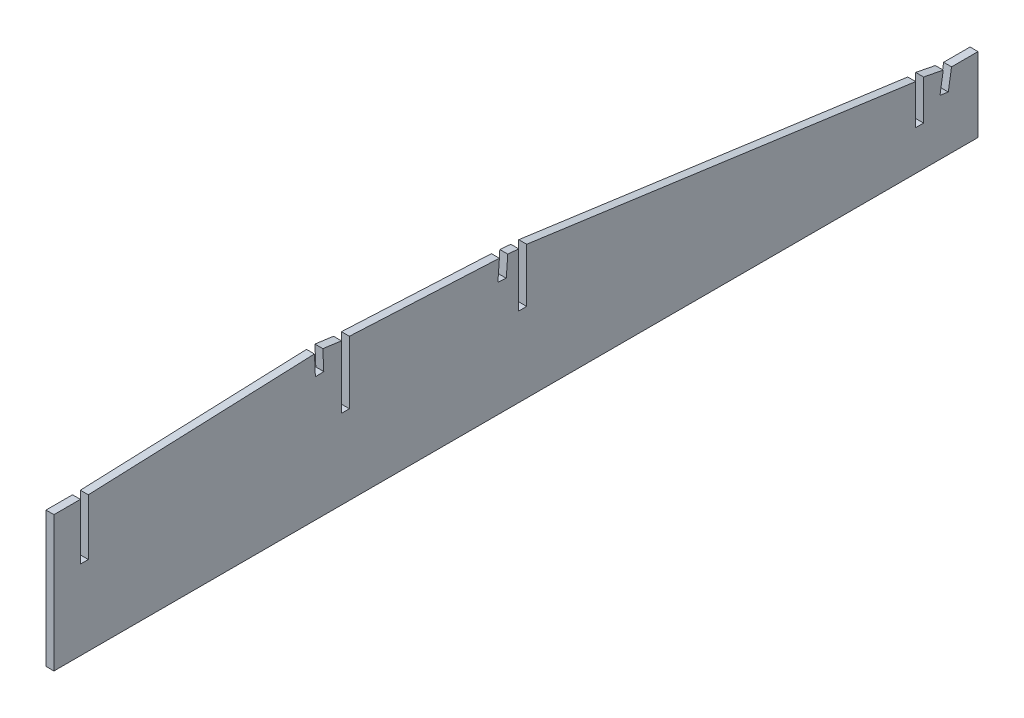
ISO-10303-21;
HEADER;
FILE_DESCRIPTION(('STEP AP214'),'2;1');
FILE_NAME('part.step','',(''),(''),'','','');
FILE_SCHEMA(('AUTOMOTIVE_DESIGN { 1 0 10303 214 1 1 1 1 }'));
ENDSEC;
DATA;
#1=APPLICATION_CONTEXT('core data for automotive mechanical design processes');
#2=APPLICATION_PROTOCOL_DEFINITION('international standard','automotive_design',2000,#1);
#3=PRODUCT_CONTEXT('',#1,'mechanical');
#4=PRODUCT('Part','Part','',(#3));
#5=PRODUCT_RELATED_PRODUCT_CATEGORY('part','',(#4));
#6=PRODUCT_DEFINITION_FORMATION('','',#4);
#7=PRODUCT_DEFINITION_CONTEXT('part definition',#1,'design');
#8=PRODUCT_DEFINITION('design','',#6,#7);
#9=PRODUCT_DEFINITION_SHAPE('','',#8);
#10=(LENGTH_UNIT() NAMED_UNIT(*) SI_UNIT(.MILLI.,.METRE.));
#11=(NAMED_UNIT(*) PLANE_ANGLE_UNIT() SI_UNIT($,.RADIAN.));
#12=(NAMED_UNIT(*) SI_UNIT($,.STERADIAN.) SOLID_ANGLE_UNIT());
#13=UNCERTAINTY_MEASURE_WITH_UNIT(LENGTH_MEASURE(1.E-05),#10,'distance_accuracy_value','');
#14=(GEOMETRIC_REPRESENTATION_CONTEXT(3) GLOBAL_UNCERTAINTY_ASSIGNED_CONTEXT((#13)) GLOBAL_UNIT_ASSIGNED_CONTEXT((#10,
#11,#12)) REPRESENTATION_CONTEXT('',''));
#15=CARTESIAN_POINT('',(0.,0.,0.));
#16=DIRECTION('',(0.,0.,1.));
#17=DIRECTION('',(1.,0.,0.));
#18=AXIS2_PLACEMENT_3D('',#15,#16,#17);
#19=CARTESIAN_POINT('',(344.221000000001,70.9886346144314,-342.788996051984));
#20=DIRECTION('',(0.,-0.99922516636213,-0.0393581873131127));
#21=DIRECTION('',(0.,0.0393581873131127,-0.99922516636213));
#22=AXIS2_PLACEMENT_3D('',#19,#20,#21);
#23=PLANE('',#22);
#24=DIRECTION('',(0.,-0.0393581873131127,0.99922516636213));
#25=VECTOR('',#24,1.);
#26=CARTESIAN_POINT('',(341.221000000001,70.9886346144314,-342.788996051984));
#27=LINE('',#26,#25);
#28=CARTESIAN_POINT('',(341.221000000001,70.9886346144314,-342.788996051984));
#29=VERTEX_POINT('',#28);
#30=CARTESIAN_POINT('',(341.221000000001,67.6230259796438,-257.342966201798));
#31=VERTEX_POINT('',#30);
#32=EDGE_CURVE('E273',#29,#31,#27,.T.);
#33=ORIENTED_EDGE('',*,*,#32,.T.);
#34=DIRECTION('',(-1.,0.,0.));
#35=VECTOR('',#34,1.);
#36=CARTESIAN_POINT('',(344.221000000001,67.6230259796438,-257.342966201798));
#37=LINE('',#36,#35);
#38=CARTESIAN_POINT('',(344.221000000001,67.6230259796438,-257.342966201798));
#39=VERTEX_POINT('',#38);
#40=EDGE_CURVE('E11',#39,#31,#37,.T.);
#41=ORIENTED_EDGE('',*,*,#40,.F.);
#42=DIRECTION('',(0.,-0.0393581873131127,0.99922516636213));
#43=VECTOR('',#42,1.);
#44=CARTESIAN_POINT('',(344.221000000001,70.9886346144314,-342.788996051984));
#45=LINE('',#44,#43);
#46=CARTESIAN_POINT('',(344.221000000001,70.9886346144314,-342.788996051984));
#47=VERTEX_POINT('',#46);
#48=EDGE_CURVE('E335',#47,#39,#45,.T.);
#49=ORIENTED_EDGE('',*,*,#48,.F.);
#50=DIRECTION('',(-1.,0.,0.));
#51=VECTOR('',#50,1.);
#52=CARTESIAN_POINT('',(344.221000000001,70.9886346144314,-342.788996051984));
#53=LINE('',#52,#51);
#54=EDGE_CURVE('E269',#47,#29,#53,.T.);
#55=ORIENTED_EDGE('',*,*,#54,.T.);
#56=EDGE_LOOP('',(#33,#41,#49,#55));
#57=FACE_BOUND('',#56,.T.);
#58=ADVANCED_FACE('F33',(#57),#23,.F.);
#59=CARTESIAN_POINT('',(344.221000000001,67.6230259796438,-257.342966201798));
#60=DIRECTION('',(0.,0.,-1.));
#61=DIRECTION('',(-1.,0.,0.));
#62=AXIS2_PLACEMENT_3D('',#59,#60,#61);
#63=PLANE('',#62);
#64=DIRECTION('',(0.,-1.,0.));
#65=VECTOR('',#64,1.);
#66=CARTESIAN_POINT('',(341.221000000001,67.6230259796438,-257.342966201798));
#67=LINE('',#66,#65);
#68=CARTESIAN_POINT('',(341.221000000001,46.4388254453726,-257.342966201798));
#69=VERTEX_POINT('',#68);
#70=EDGE_CURVE('E276',#31,#69,#67,.T.);
#71=ORIENTED_EDGE('',*,*,#70,.T.);
#72=DIRECTION('',(-1.,0.,0.));
#73=VECTOR('',#72,1.);
#74=CARTESIAN_POINT('',(344.221000000001,46.4388254453726,-257.342966201798));
#75=LINE('',#74,#73);
#76=CARTESIAN_POINT('',(344.221000000001,46.4388254453726,-257.342966201798));
#77=VERTEX_POINT('',#76);
#78=EDGE_CURVE('E41',#77,#69,#75,.T.);
#79=ORIENTED_EDGE('',*,*,#78,.F.);
#80=DIRECTION('',(0.,-1.,0.));
#81=VECTOR('',#80,1.);
#82=CARTESIAN_POINT('',(344.221000000001,67.6230259796438,-257.342966201798));
#83=LINE('',#82,#81);
#84=EDGE_CURVE('E164',#39,#77,#83,.T.);
#85=ORIENTED_EDGE('',*,*,#84,.F.);
#86=ORIENTED_EDGE('',*,*,#40,.T.);
#87=EDGE_LOOP('',(#71,#79,#85,#86));
#88=FACE_BOUND('',#87,.T.);
#89=ADVANCED_FACE('F513',(#88),#63,.F.);
#90=CARTESIAN_POINT('',(344.221000000001,46.4388254453726,-254.342966201798));
#91=DIRECTION('',(0.,-1.,0.));
#92=DIRECTION('',(0.,0.,-1.));
#93=AXIS2_PLACEMENT_3D('',#90,#91,#92);
#94=PLANE('',#93);
#95=DIRECTION('',(0.,0.,1.));
#96=VECTOR('',#95,1.);
#97=CARTESIAN_POINT('',(341.221000000001,46.4388254453726,-254.342966201798));
#98=LINE('',#97,#96);
#99=CARTESIAN_POINT('',(341.221000000001,46.4388254453726,-254.342966201798));
#100=VERTEX_POINT('',#99);
#101=EDGE_CURVE('E278',#69,#100,#98,.T.);
#102=ORIENTED_EDGE('',*,*,#101,.T.);
#103=DIRECTION('',(-1.,0.,0.));
#104=VECTOR('',#103,1.);
#105=CARTESIAN_POINT('',(344.221000000001,46.4388254453726,-254.342966201798));
#106=LINE('',#105,#104);
#107=CARTESIAN_POINT('',(344.221000000001,46.4388254453726,-254.342966201798));
#108=VERTEX_POINT('',#107);
#109=EDGE_CURVE('E414',#108,#100,#106,.T.);
#110=ORIENTED_EDGE('',*,*,#109,.F.);
#111=DIRECTION('',(0.,0.,1.));
#112=VECTOR('',#111,1.);
#113=CARTESIAN_POINT('',(344.221000000001,46.4388254453726,-254.342966201798));
#114=LINE('',#113,#112);
#115=EDGE_CURVE('E422',#77,#108,#114,.T.);
#116=ORIENTED_EDGE('',*,*,#115,.F.);
#117=ORIENTED_EDGE('',*,*,#78,.T.);
#118=EDGE_LOOP('',(#102,#110,#116,#117));
#119=FACE_BOUND('',#118,.T.);
#120=ADVANCED_FACE('F420',(#119),#94,.F.);
#121=CARTESIAN_POINT('',(344.221000000001,67.6230259796438,-254.342966201798));
#122=DIRECTION('',(0.,0.,1.));
#123=DIRECTION('',(1.,0.,0.));
#124=AXIS2_PLACEMENT_3D('',#121,#122,#123);
#125=PLANE('',#124);
#126=DIRECTION('',(0.,1.,0.));
#127=VECTOR('',#126,1.);
#128=CARTESIAN_POINT('',(341.221000000001,67.6230259796438,-254.342966201798));
#129=LINE('',#128,#127);
#130=CARTESIAN_POINT('',(341.221000000001,67.6230259796438,-254.342966201798));
#131=VERTEX_POINT('',#130);
#132=EDGE_CURVE('E280',#100,#131,#129,.T.);
#133=ORIENTED_EDGE('',*,*,#132,.T.);
#134=DIRECTION('',(-1.,0.,0.));
#135=VECTOR('',#134,1.);
#136=CARTESIAN_POINT('',(344.221000000001,67.6230259796438,-254.342966201798));
#137=LINE('',#136,#135);
#138=CARTESIAN_POINT('',(344.221000000001,67.6230259796438,-254.342966201798));
#139=VERTEX_POINT('',#138);
#140=EDGE_CURVE('E411',#139,#131,#137,.T.);
#141=ORIENTED_EDGE('',*,*,#140,.F.);
#142=DIRECTION('',(0.,1.,0.));
#143=VECTOR('',#142,1.);
#144=CARTESIAN_POINT('',(344.221000000001,67.6230259796438,-254.342966201798));
#145=LINE('',#144,#143);
#146=EDGE_CURVE('E440',#108,#139,#145,.T.);
#147=ORIENTED_EDGE('',*,*,#146,.F.);
#148=ORIENTED_EDGE('',*,*,#109,.T.);
#149=EDGE_LOOP('',(#133,#141,#147,#148));
#150=FACE_BOUND('',#149,.T.);
#151=ADVANCED_FACE('F431',(#150),#125,.F.);
#152=CARTESIAN_POINT('',(344.221000000001,67.6230259796438,-254.342966201798));
#153=DIRECTION('',(0.,-1.,0.));
#154=DIRECTION('',(0.,0.,-1.));
#155=AXIS2_PLACEMENT_3D('',#152,#153,#154);
#156=PLANE('',#155);
#157=DIRECTION('',(0.,0.,1.));
#158=VECTOR('',#157,1.);
#159=CARTESIAN_POINT('',(341.221000000001,67.6230259796438,-254.342966201798));
#160=LINE('',#159,#158);
#161=CARTESIAN_POINT('',(341.221000000001,67.6230259796438,-244.342966201798));
#162=VERTEX_POINT('',#161);
#163=EDGE_CURVE('E282',#131,#162,#160,.T.);
#164=ORIENTED_EDGE('',*,*,#163,.T.);
#165=DIRECTION('',(-1.,0.,0.));
#166=VECTOR('',#165,1.);
#167=CARTESIAN_POINT('',(344.221000000001,67.6230259796438,-244.342966201798));
#168=LINE('',#167,#166);
#169=CARTESIAN_POINT('',(344.221000000001,67.6230259796438,-244.342966201798));
#170=VERTEX_POINT('',#169);
#171=EDGE_CURVE('E408',#170,#162,#168,.T.);
#172=ORIENTED_EDGE('',*,*,#171,.F.);
#173=DIRECTION('',(0.,0.,1.));
#174=VECTOR('',#173,1.);
#175=CARTESIAN_POINT('',(344.221000000001,67.6230259796438,-254.342966201798));
#176=LINE('',#175,#174);
#177=EDGE_CURVE('E437',#139,#170,#176,.T.);
#178=ORIENTED_EDGE('',*,*,#177,.F.);
#179=ORIENTED_EDGE('',*,*,#140,.T.);
#180=EDGE_LOOP('',(#164,#172,#178,#179));
#181=FACE_BOUND('',#180,.T.);
#182=ADVANCED_FACE('F435',(#181),#156,.F.);
#183=CARTESIAN_POINT('',(344.221000000001,67.6230259796438,-244.342966201798));
#184=DIRECTION('',(0.,0.,-1.));
#185=DIRECTION('',(-1.,0.,0.));
#186=AXIS2_PLACEMENT_3D('',#183,#184,#185);
#187=PLANE('',#186);
#188=DIRECTION('',(0.,-1.,0.));
#189=VECTOR('',#188,1.);
#190=CARTESIAN_POINT('',(341.221000000001,67.6230259796438,-244.342966201798));
#191=LINE('',#190,#189);
#192=CARTESIAN_POINT('',(341.221000000001,16.4388254453726,-244.342966201798));
#193=VERTEX_POINT('',#192);
#194=EDGE_CURVE('E284',#162,#193,#191,.T.);
#195=ORIENTED_EDGE('',*,*,#194,.T.);
#196=DIRECTION('',(-1.,0.,0.));
#197=VECTOR('',#196,1.);
#198=CARTESIAN_POINT('',(344.221000000001,16.4388254453726,-244.342966201798));
#199=LINE('',#198,#197);
#200=CARTESIAN_POINT('',(344.221000000001,16.4388254453726,-244.342966201798));
#201=VERTEX_POINT('',#200);
#202=EDGE_CURVE('E405',#201,#193,#199,.T.);
#203=ORIENTED_EDGE('',*,*,#202,.F.);
#204=DIRECTION('',(0.,-1.,0.));
#205=VECTOR('',#204,1.);
#206=CARTESIAN_POINT('',(344.221000000001,67.6230259796438,-244.342966201798));
#207=LINE('',#206,#205);
#208=EDGE_CURVE('E439',#170,#201,#207,.T.);
#209=ORIENTED_EDGE('',*,*,#208,.F.);
#210=ORIENTED_EDGE('',*,*,#171,.T.);
#211=EDGE_LOOP('',(#195,#203,#209,#210));
#212=FACE_BOUND('',#211,.T.);
#213=ADVANCED_FACE('F526',(#212),#187,.F.);
#214=CARTESIAN_POINT('',(344.221000000001,16.4388254453726,-244.342966201798));
#215=DIRECTION('',(0.,1.,0.));
#216=DIRECTION('',(0.,0.,1.));
#217=AXIS2_PLACEMENT_3D('',#214,#215,#216);
#218=PLANE('',#217);
#219=DIRECTION('',(0.,0.,-1.));
#220=VECTOR('',#219,1.);
#221=CARTESIAN_POINT('',(341.221000000001,16.4388254453726,-244.342966201798));
#222=LINE('',#221,#220);
#223=CARTESIAN_POINT('',(341.221000000001,16.4388254453726,-593.555772860342));
#224=VERTEX_POINT('',#223);
#225=EDGE_CURVE('E286',#193,#224,#222,.T.);
#226=ORIENTED_EDGE('',*,*,#225,.T.);
#227=DIRECTION('',(-1.,0.,0.));
#228=VECTOR('',#227,1.);
#229=CARTESIAN_POINT('',(344.221000000001,16.4388254453726,-593.555772860342));
#230=LINE('',#229,#228);
#231=CARTESIAN_POINT('',(344.221000000001,16.4388254453726,-593.555772860342));
#232=VERTEX_POINT('',#231);
#233=EDGE_CURVE('E402',#232,#224,#230,.T.);
#234=ORIENTED_EDGE('',*,*,#233,.F.);
#235=DIRECTION('',(0.,0.,-1.));
#236=VECTOR('',#235,1.);
#237=CARTESIAN_POINT('',(344.221000000001,16.4388254453726,-244.342966201798));
#238=LINE('',#237,#236);
#239=EDGE_CURVE('E442',#201,#232,#238,.T.);
#240=ORIENTED_EDGE('',*,*,#239,.F.);
#241=ORIENTED_EDGE('',*,*,#202,.T.);
#242=EDGE_LOOP('',(#226,#234,#240,#241));
#243=FACE_BOUND('',#242,.T.);
#244=ADVANCED_FACE('F529',(#243),#218,.F.);
#245=CARTESIAN_POINT('',(344.221000000001,16.4388254453726,-593.555772860342));
#246=DIRECTION('',(0.,1.73664748005717E-13,1.));
#247=DIRECTION('',(0.,-1.,1.73664748005717E-13));
#248=AXIS2_PLACEMENT_3D('',#245,#246,#247);
#249=PLANE('',#248);
#250=DIRECTION('',(0.,1.,-1.73664748005717E-13));
#251=VECTOR('',#250,1.);
#252=CARTESIAN_POINT('',(341.221000000001,16.4388254453726,-593.555772860342));
#253=LINE('',#252,#251);
#254=CARTESIAN_POINT('',(341.221000000001,44.5676274299289,-593.555772860347));
#255=VERTEX_POINT('',#254);
#256=EDGE_CURVE('E288',#224,#255,#253,.T.);
#257=ORIENTED_EDGE('',*,*,#256,.T.);
#258=DIRECTION('',(-1.,0.,0.));
#259=VECTOR('',#258,1.);
#260=CARTESIAN_POINT('',(344.221000000001,44.5676274299289,-593.555772860347));
#261=LINE('',#260,#259);
#262=CARTESIAN_POINT('',(344.221000000001,44.5676274299289,-593.555772860347));
#263=VERTEX_POINT('',#262);
#264=EDGE_CURVE('E399',#263,#255,#261,.T.);
#265=ORIENTED_EDGE('',*,*,#264,.F.);
#266=DIRECTION('',(0.,1.,-1.73664748005717E-13));
#267=VECTOR('',#266,1.);
#268=CARTESIAN_POINT('',(344.221000000001,16.4388254453726,-593.555772860342));
#269=LINE('',#268,#267);
#270=EDGE_CURVE('E448',#232,#263,#269,.T.);
#271=ORIENTED_EDGE('',*,*,#270,.F.);
#272=ORIENTED_EDGE('',*,*,#233,.T.);
#273=EDGE_LOOP('',(#257,#265,#271,#272));
#274=FACE_BOUND('',#273,.T.);
#275=ADVANCED_FACE('F533',(#274),#249,.F.);
#276=CARTESIAN_POINT('',(344.221000000001,44.5676274299289,-593.555772860347));
#277=DIRECTION('',(0.,-1.,0.));
#278=DIRECTION('',(0.,0.,-1.));
#279=AXIS2_PLACEMENT_3D('',#276,#277,#278);
#280=PLANE('',#279);
#281=DIRECTION('',(0.,0.,1.));
#282=VECTOR('',#281,1.);
#283=CARTESIAN_POINT('',(341.221000000001,44.5676274299289,-593.555772860347));
#284=LINE('',#283,#282);
#285=CARTESIAN_POINT('',(341.221000000001,44.5676274299289,-583.555772860347));
#286=VERTEX_POINT('',#285);
#287=EDGE_CURVE('E290',#255,#286,#284,.T.);
#288=ORIENTED_EDGE('',*,*,#287,.T.);
#289=DIRECTION('',(-1.,0.,0.));
#290=VECTOR('',#289,1.);
#291=CARTESIAN_POINT('',(344.221000000001,44.5676274299289,-583.555772860347));
#292=LINE('',#291,#290);
#293=CARTESIAN_POINT('',(344.221000000001,44.5676274299289,-583.555772860347));
#294=VERTEX_POINT('',#293);
#295=EDGE_CURVE('E396',#294,#286,#292,.T.);
#296=ORIENTED_EDGE('',*,*,#295,.F.);
#297=DIRECTION('',(0.,0.,1.));
#298=VECTOR('',#297,1.);
#299=CARTESIAN_POINT('',(344.221000000001,44.5676274299289,-593.555772860347));
#300=LINE('',#299,#298);
#301=EDGE_CURVE('E450',#263,#294,#300,.T.);
#302=ORIENTED_EDGE('',*,*,#301,.F.);
#303=ORIENTED_EDGE('',*,*,#264,.T.);
#304=EDGE_LOOP('',(#288,#296,#302,#303));
#305=FACE_BOUND('',#304,.T.);
#306=ADVANCED_FACE('F537',(#305),#280,.F.);
#307=CARTESIAN_POINT('',(344.221000000001,44.5676274299289,-583.555772860347));
#308=DIRECTION('',(0.,-0.158466902588744,-0.98736428980591));
#309=DIRECTION('',(0.,0.98736428980591,-0.158466902588744));
#310=AXIS2_PLACEMENT_3D('',#307,#308,#309);
#311=PLANE('',#310);
#312=DIRECTION('',(0.,-0.98736428980591,0.158466902588744));
#313=VECTOR('',#312,1.);
#314=CARTESIAN_POINT('',(341.221000000001,44.5676274299289,-583.555772860347));
#315=LINE('',#314,#313);
#316=CARTESIAN_POINT('',(341.221000000001,36.9403484697875,-582.33163372095));
#317=VERTEX_POINT('',#316);
#318=EDGE_CURVE('E292',#286,#317,#315,.T.);
#319=ORIENTED_EDGE('',*,*,#318,.T.);
#320=DIRECTION('',(-1.,0.,0.));
#321=VECTOR('',#320,1.);
#322=CARTESIAN_POINT('',(344.221000000001,36.9403484697875,-582.33163372095));
#323=LINE('',#322,#321);
#324=CARTESIAN_POINT('',(344.221000000001,36.9403484697875,-582.33163372095));
#325=VERTEX_POINT('',#324);
#326=EDGE_CURVE('E393',#325,#317,#323,.T.);
#327=ORIENTED_EDGE('',*,*,#326,.F.);
#328=DIRECTION('',(0.,-0.98736428980591,0.158466902588744));
#329=VECTOR('',#328,1.);
#330=CARTESIAN_POINT('',(344.221000000001,44.5676274299289,-583.555772860347));
#331=LINE('',#330,#329);
#332=EDGE_CURVE('E452',#294,#325,#331,.T.);
#333=ORIENTED_EDGE('',*,*,#332,.F.);
#334=ORIENTED_EDGE('',*,*,#295,.T.);
#335=EDGE_LOOP('',(#319,#327,#333,#334));
#336=FACE_BOUND('',#335,.T.);
#337=ADVANCED_FACE('F541',(#336),#311,.F.);
#338=CARTESIAN_POINT('',(344.221000000001,37.4434808855068,-579.196752100816));
#339=DIRECTION('',(0.,-0.98736428980591,0.158466902588746));
#340=DIRECTION('',(0.,-0.158466902588746,-0.98736428980591));
#341=AXIS2_PLACEMENT_3D('',#338,#339,#340);
#342=PLANE('',#341);
#343=DIRECTION('',(0.,0.158466902588746,0.98736428980591));
#344=VECTOR('',#343,1.);
#345=CARTESIAN_POINT('',(341.221000000001,37.4434808855068,-579.196752100816));
#346=LINE('',#345,#344);
#347=CARTESIAN_POINT('',(341.221000000001,37.4434808855068,-579.196752100816));
#348=VERTEX_POINT('',#347);
#349=EDGE_CURVE('E294',#317,#348,#346,.T.);
#350=ORIENTED_EDGE('',*,*,#349,.T.);
#351=DIRECTION('',(-1.,0.,0.));
#352=VECTOR('',#351,1.);
#353=CARTESIAN_POINT('',(344.221000000001,37.4434808855068,-579.196752100816));
#354=LINE('',#353,#352);
#355=CARTESIAN_POINT('',(344.221000000001,37.4434808855068,-579.196752100816));
#356=VERTEX_POINT('',#355);
#357=EDGE_CURVE('E390',#356,#348,#354,.T.);
#358=ORIENTED_EDGE('',*,*,#357,.F.);
#359=DIRECTION('',(0.,0.158466902588746,0.98736428980591));
#360=VECTOR('',#359,1.);
#361=CARTESIAN_POINT('',(344.221000000001,37.4434808855068,-579.196752100816));
#362=LINE('',#361,#360);
#363=EDGE_CURVE('E454',#325,#356,#362,.T.);
#364=ORIENTED_EDGE('',*,*,#363,.F.);
#365=ORIENTED_EDGE('',*,*,#326,.T.);
#366=EDGE_LOOP('',(#350,#358,#364,#365));
#367=FACE_BOUND('',#366,.T.);
#368=ADVANCED_FACE('F545',(#367),#342,.F.);
#369=CARTESIAN_POINT('',(344.221000000001,45.0707593406353,-580.420891159161));
#370=DIRECTION('',(0.,0.158466902588734,0.987364289805912));
#371=DIRECTION('',(0.,-0.987364289805912,0.158466902588734));
#372=AXIS2_PLACEMENT_3D('',#369,#370,#371);
#373=PLANE('',#372);
#374=DIRECTION('',(0.,0.987364289805912,-0.158466902588734));
#375=VECTOR('',#374,1.);
#376=CARTESIAN_POINT('',(341.221000000001,45.0707593406353,-580.420891159161));
#377=LINE('',#376,#375);
#378=CARTESIAN_POINT('',(341.221000000001,45.0707593406353,-580.420891159161));
#379=VERTEX_POINT('',#378);
#380=EDGE_CURVE('E296',#348,#379,#377,.T.);
#381=ORIENTED_EDGE('',*,*,#380,.T.);
#382=DIRECTION('',(-1.,0.,0.));
#383=VECTOR('',#382,1.);
#384=CARTESIAN_POINT('',(344.221000000001,45.0707593406353,-580.420891159161));
#385=LINE('',#384,#383);
#386=CARTESIAN_POINT('',(344.221000000001,45.0707593406353,-580.420891159161));
#387=VERTEX_POINT('',#386);
#388=EDGE_CURVE('E387',#387,#379,#385,.T.);
#389=ORIENTED_EDGE('',*,*,#388,.F.);
#390=DIRECTION('',(0.,0.987364289805912,-0.158466902588734));
#391=VECTOR('',#390,1.);
#392=CARTESIAN_POINT('',(344.221000000001,45.0707593406353,-580.420891159161));
#393=LINE('',#392,#391);
#394=EDGE_CURVE('E456',#356,#387,#393,.T.);
#395=ORIENTED_EDGE('',*,*,#394,.F.);
#396=ORIENTED_EDGE('',*,*,#357,.T.);
#397=EDGE_LOOP('',(#381,#389,#395,#396));
#398=FACE_BOUND('',#397,.T.);
#399=ADVANCED_FACE('F549',(#398),#373,.F.);
#400=CARTESIAN_POINT('',(344.221000000001,45.0707593406353,-580.420891159161));
#401=DIRECTION('',(0.,-0.981246454057188,0.19275735109249));
#402=DIRECTION('',(0.,-0.19275735109249,-0.981246454057189));
#403=AXIS2_PLACEMENT_3D('',#400,#401,#402);
#404=PLANE('',#403);
#405=DIRECTION('',(0.,0.19275735109249,0.981246454057189));
#406=VECTOR('',#405,1.);
#407=CARTESIAN_POINT('',(341.221000000001,45.0707593406353,-580.420891159161));
#408=LINE('',#407,#406);
#409=CARTESIAN_POINT('',(341.221000000001,46.5285290137598,-573.));
#410=VERTEX_POINT('',#409);
#411=EDGE_CURVE('E298',#379,#410,#408,.T.);
#412=ORIENTED_EDGE('',*,*,#411,.T.);
#413=DIRECTION('',(-1.,0.,0.));
#414=VECTOR('',#413,1.);
#415=CARTESIAN_POINT('',(344.221000000001,46.5285290137598,-573.));
#416=LINE('',#415,#414);
#417=CARTESIAN_POINT('',(344.221000000001,46.5285290137598,-573.));
#418=VERTEX_POINT('',#417);
#419=EDGE_CURVE('E384',#418,#410,#416,.T.);
#420=ORIENTED_EDGE('',*,*,#419,.F.);
#421=DIRECTION('',(0.,0.19275735109249,0.981246454057189));
#422=VECTOR('',#421,1.);
#423=CARTESIAN_POINT('',(344.221000000001,45.0707593406353,-580.420891159161));
#424=LINE('',#423,#422);
#425=EDGE_CURVE('E458',#387,#418,#424,.T.);
#426=ORIENTED_EDGE('',*,*,#425,.F.);
#427=ORIENTED_EDGE('',*,*,#388,.T.);
#428=EDGE_LOOP('',(#412,#420,#426,#427));
#429=FACE_BOUND('',#428,.T.);
#430=ADVANCED_FACE('F553',(#429),#404,.F.);
#431=CARTESIAN_POINT('',(344.221000000001,31.4436219160998,-573.));
#432=DIRECTION('',(0.,0.,-1.));
#433=DIRECTION('',(-1.,0.,0.));
#434=AXIS2_PLACEMENT_3D('',#431,#432,#433);
#435=PLANE('',#434);
#436=DIRECTION('',(0.,-1.,0.));
#437=VECTOR('',#436,1.);
#438=CARTESIAN_POINT('',(341.221000000001,31.4436219160998,-573.));
#439=LINE('',#438,#437);
#440=CARTESIAN_POINT('',(341.221000000001,31.4436219160998,-573.));
#441=VERTEX_POINT('',#440);
#442=EDGE_CURVE('E300',#410,#441,#439,.T.);
#443=ORIENTED_EDGE('',*,*,#442,.T.);
#444=DIRECTION('',(-1.,0.,0.));
#445=VECTOR('',#444,1.);
#446=CARTESIAN_POINT('',(344.221000000001,31.4436219160998,-573.));
#447=LINE('',#446,#445);
#448=CARTESIAN_POINT('',(344.221000000001,31.4436219160998,-573.));
#449=VERTEX_POINT('',#448);
#450=EDGE_CURVE('E381',#449,#441,#447,.T.);
#451=ORIENTED_EDGE('',*,*,#450,.F.);
#452=DIRECTION('',(0.,-1.,0.));
#453=VECTOR('',#452,1.);
#454=CARTESIAN_POINT('',(344.221000000001,31.4436219160998,-573.));
#455=LINE('',#454,#453);
#456=EDGE_CURVE('E460',#418,#449,#455,.T.);
#457=ORIENTED_EDGE('',*,*,#456,.F.);
#458=ORIENTED_EDGE('',*,*,#419,.T.);
#459=EDGE_LOOP('',(#443,#451,#457,#458));
#460=FACE_BOUND('',#459,.T.);
#461=ADVANCED_FACE('F557',(#460),#435,.F.);
#462=CARTESIAN_POINT('',(344.221000000001,31.4436219160998,-570.));
#463=DIRECTION('',(0.,-1.,0.));
#464=DIRECTION('',(0.,0.,-1.));
#465=AXIS2_PLACEMENT_3D('',#462,#463,#464);
#466=PLANE('',#465);
#467=DIRECTION('',(0.,0.,1.));
#468=VECTOR('',#467,1.);
#469=CARTESIAN_POINT('',(341.221000000001,31.4436219160998,-570.));
#470=LINE('',#469,#468);
#471=CARTESIAN_POINT('',(341.221000000001,31.4436219160998,-570.));
#472=VERTEX_POINT('',#471);
#473=EDGE_CURVE('E302',#441,#472,#470,.T.);
#474=ORIENTED_EDGE('',*,*,#473,.T.);
#475=DIRECTION('',(-1.,0.,0.));
#476=VECTOR('',#475,1.);
#477=CARTESIAN_POINT('',(344.221000000001,31.4436219160998,-570.));
#478=LINE('',#477,#476);
#479=CARTESIAN_POINT('',(344.221000000001,31.4436219160998,-570.));
#480=VERTEX_POINT('',#479);
#481=EDGE_CURVE('E378',#480,#472,#478,.T.);
#482=ORIENTED_EDGE('',*,*,#481,.F.);
#483=DIRECTION('',(0.,0.,1.));
#484=VECTOR('',#483,1.);
#485=CARTESIAN_POINT('',(344.221000000001,31.4436219160998,-570.));
#486=LINE('',#485,#484);
#487=EDGE_CURVE('E462',#449,#480,#486,.T.);
#488=ORIENTED_EDGE('',*,*,#487,.F.);
#489=ORIENTED_EDGE('',*,*,#450,.T.);
#490=EDGE_LOOP('',(#474,#482,#488,#489));
#491=FACE_BOUND('',#490,.T.);
#492=ADVANCED_FACE('F561',(#491),#466,.F.);
#493=CARTESIAN_POINT('',(344.221000000001,31.4436219160998,-570.));
#494=DIRECTION('',(0.,0.,1.));
#495=DIRECTION('',(1.,0.,0.));
#496=AXIS2_PLACEMENT_3D('',#493,#494,#495);
#497=PLANE('',#496);
#498=DIRECTION('',(0.,1.,0.));
#499=VECTOR('',#498,1.);
#500=CARTESIAN_POINT('',(341.221000000001,31.4436219160998,-570.));
#501=LINE('',#500,#499);
#502=CARTESIAN_POINT('',(341.221000000001,46.5285290137598,-570.));
#503=VERTEX_POINT('',#502);
#504=EDGE_CURVE('E304',#472,#503,#501,.T.);
#505=ORIENTED_EDGE('',*,*,#504,.T.);
#506=DIRECTION('',(-1.,0.,0.));
#507=VECTOR('',#506,1.);
#508=CARTESIAN_POINT('',(344.221000000001,46.5285290137598,-570.));
#509=LINE('',#508,#507);
#510=CARTESIAN_POINT('',(344.221000000001,46.5285290137598,-570.));
#511=VERTEX_POINT('',#510);
#512=EDGE_CURVE('E375',#511,#503,#509,.T.);
#513=ORIENTED_EDGE('',*,*,#512,.F.);
#514=DIRECTION('',(0.,1.,0.));
#515=VECTOR('',#514,1.);
#516=CARTESIAN_POINT('',(344.221000000001,31.4436219160998,-570.));
#517=LINE('',#516,#515);
#518=EDGE_CURVE('E464',#480,#511,#517,.T.);
#519=ORIENTED_EDGE('',*,*,#518,.F.);
#520=ORIENTED_EDGE('',*,*,#481,.T.);
#521=EDGE_LOOP('',(#505,#513,#519,#520));
#522=FACE_BOUND('',#521,.T.);
#523=ADVANCED_FACE('F565',(#522),#497,.F.);
#524=CARTESIAN_POINT('',(344.221000000001,46.5285290137598,-570.));
#525=DIRECTION('',(0.,-0.990641228909688,0.13649159528815));
#526=DIRECTION('',(0.,-0.13649159528815,-0.990641228909688));
#527=AXIS2_PLACEMENT_3D('',#524,#525,#526);
#528=PLANE('',#527);
#529=DIRECTION('',(0.,0.13649159528815,0.990641228909688));
#530=VECTOR('',#529,1.);
#531=CARTESIAN_POINT('',(341.221000000001,46.5285290137598,-570.));
#532=LINE('',#531,#530);
#533=CARTESIAN_POINT('',(341.221000000001,66.7823443424848,-423.));
#534=VERTEX_POINT('',#533);
#535=EDGE_CURVE('E306',#503,#534,#532,.T.);
#536=ORIENTED_EDGE('',*,*,#535,.T.);
#537=DIRECTION('',(-1.,0.,0.));
#538=VECTOR('',#537,1.);
#539=CARTESIAN_POINT('',(344.221000000001,66.7823443424848,-423.));
#540=LINE('',#539,#538);
#541=CARTESIAN_POINT('',(344.221000000001,66.7823443424848,-423.));
#542=VERTEX_POINT('',#541);
#543=EDGE_CURVE('E372',#542,#534,#540,.T.);
#544=ORIENTED_EDGE('',*,*,#543,.F.);
#545=DIRECTION('',(0.,0.13649159528815,0.990641228909688));
#546=VECTOR('',#545,1.);
#547=CARTESIAN_POINT('',(344.221000000001,46.5285290137598,-570.));
#548=LINE('',#547,#546);
#549=EDGE_CURVE('E466',#511,#542,#548,.T.);
#550=ORIENTED_EDGE('',*,*,#549,.F.);
#551=ORIENTED_EDGE('',*,*,#512,.T.);
#552=EDGE_LOOP('',(#536,#544,#550,#551));
#553=FACE_BOUND('',#552,.T.);
#554=ADVANCED_FACE('F569',(#553),#528,.F.);
#555=CARTESIAN_POINT('',(344.221000000001,46.4388254453726,-423.));
#556=DIRECTION('',(0.,0.,-1.));
#557=DIRECTION('',(-1.,0.,0.));
#558=AXIS2_PLACEMENT_3D('',#555,#556,#557);
#559=PLANE('',#558);
#560=DIRECTION('',(0.,-1.,0.));
#561=VECTOR('',#560,1.);
#562=CARTESIAN_POINT('',(341.221000000001,46.4388254453726,-423.));
#563=LINE('',#562,#561);
#564=CARTESIAN_POINT('',(341.221000000001,46.4388254453726,-423.));
#565=VERTEX_POINT('',#564);
#566=EDGE_CURVE('E308',#534,#565,#563,.T.);
#567=ORIENTED_EDGE('',*,*,#566,.T.);
#568=DIRECTION('',(-1.,0.,0.));
#569=VECTOR('',#568,1.);
#570=CARTESIAN_POINT('',(344.221000000001,46.4388254453726,-423.));
#571=LINE('',#570,#569);
#572=CARTESIAN_POINT('',(344.221000000001,46.4388254453726,-423.));
#573=VERTEX_POINT('',#572);
#574=EDGE_CURVE('E369',#573,#565,#571,.T.);
#575=ORIENTED_EDGE('',*,*,#574,.F.);
#576=DIRECTION('',(0.,-1.,0.));
#577=VECTOR('',#576,1.);
#578=CARTESIAN_POINT('',(344.221000000001,46.4388254453726,-423.));
#579=LINE('',#578,#577);
#580=EDGE_CURVE('E468',#542,#573,#579,.T.);
#581=ORIENTED_EDGE('',*,*,#580,.F.);
#582=ORIENTED_EDGE('',*,*,#543,.T.);
#583=EDGE_LOOP('',(#567,#575,#581,#582));
#584=FACE_BOUND('',#583,.T.);
#585=ADVANCED_FACE('F573',(#584),#559,.F.);
#586=CARTESIAN_POINT('',(344.221000000001,46.4388254453726,-423.));
#587=DIRECTION('',(0.,-1.,0.));
#588=DIRECTION('',(0.,0.,-1.));
#589=AXIS2_PLACEMENT_3D('',#586,#587,#588);
#590=PLANE('',#589);
#591=DIRECTION('',(0.,0.,1.));
#592=VECTOR('',#591,1.);
#593=CARTESIAN_POINT('',(341.221000000001,46.4388254453726,-423.));
#594=LINE('',#593,#592);
#595=CARTESIAN_POINT('',(341.221000000001,46.4388254453726,-420.));
#596=VERTEX_POINT('',#595);
#597=EDGE_CURVE('E310',#565,#596,#594,.T.);
#598=ORIENTED_EDGE('',*,*,#597,.T.);
#599=DIRECTION('',(-1.,0.,0.));
#600=VECTOR('',#599,1.);
#601=CARTESIAN_POINT('',(344.221000000001,46.4388254453726,-420.));
#602=LINE('',#601,#600);
#603=CARTESIAN_POINT('',(344.221000000001,46.4388254453726,-420.));
#604=VERTEX_POINT('',#603);
#605=EDGE_CURVE('E366',#604,#596,#602,.T.);
#606=ORIENTED_EDGE('',*,*,#605,.F.);
#607=DIRECTION('',(0.,0.,1.));
#608=VECTOR('',#607,1.);
#609=CARTESIAN_POINT('',(344.221000000001,46.4388254453726,-423.));
#610=LINE('',#609,#608);
#611=EDGE_CURVE('E470',#573,#604,#610,.T.);
#612=ORIENTED_EDGE('',*,*,#611,.F.);
#613=ORIENTED_EDGE('',*,*,#574,.T.);
#614=EDGE_LOOP('',(#598,#606,#612,#613));
#615=FACE_BOUND('',#614,.T.);
#616=ADVANCED_FACE('F577',(#615),#590,.F.);
#617=CARTESIAN_POINT('',(344.221000000001,46.4388254453726,-420.));
#618=DIRECTION('',(0.,0.,1.));
#619=DIRECTION('',(1.,0.,0.));
#620=AXIS2_PLACEMENT_3D('',#617,#618,#619);
#621=PLANE('',#620);
#622=DIRECTION('',(0.,1.,0.));
#623=VECTOR('',#622,1.);
#624=CARTESIAN_POINT('',(341.221000000001,46.4388254453726,-420.));
#625=LINE('',#624,#623);
#626=CARTESIAN_POINT('',(341.221000000001,66.7823443424848,-420.));
#627=VERTEX_POINT('',#626);
#628=EDGE_CURVE('E312',#596,#627,#625,.T.);
#629=ORIENTED_EDGE('',*,*,#628,.T.);
#630=DIRECTION('',(-1.,0.,0.));
#631=VECTOR('',#630,1.);
#632=CARTESIAN_POINT('',(344.221000000001,66.7823443424848,-420.));
#633=LINE('',#632,#631);
#634=CARTESIAN_POINT('',(344.221000000001,66.7823443424848,-420.));
#635=VERTEX_POINT('',#634);
#636=EDGE_CURVE('E363',#635,#627,#633,.T.);
#637=ORIENTED_EDGE('',*,*,#636,.F.);
#638=DIRECTION('',(0.,1.,0.));
#639=VECTOR('',#638,1.);
#640=CARTESIAN_POINT('',(344.221000000001,46.4388254453726,-420.));
#641=LINE('',#640,#639);
#642=EDGE_CURVE('E472',#604,#635,#641,.T.);
#643=ORIENTED_EDGE('',*,*,#642,.F.);
#644=ORIENTED_EDGE('',*,*,#605,.T.);
#645=EDGE_LOOP('',(#629,#637,#643,#644));
#646=FACE_BOUND('',#645,.T.);
#647=ADVANCED_FACE('F581',(#646),#621,.F.);
#648=CARTESIAN_POINT('',(344.221000000001,66.7823443424848,-420.));
#649=DIRECTION('',(0.,-0.996430765730376,0.0844140338212572));
#650=DIRECTION('',(0.,-0.0844140338212572,-0.996430765730376));
#651=AXIS2_PLACEMENT_3D('',#648,#649,#650);
#652=PLANE('',#651);
#653=DIRECTION('',(0.,0.0844140338212572,0.996430765730376));
#654=VECTOR('',#653,1.);
#655=CARTESIAN_POINT('',(341.221000000001,66.7823443424848,-420.));
#656=LINE('',#655,#654);
#657=CARTESIAN_POINT('',(341.221000000001,67.1343257466869,-415.845180188231));
#658=VERTEX_POINT('',#657);
#659=EDGE_CURVE('E314',#627,#658,#656,.T.);
#660=ORIENTED_EDGE('',*,*,#659,.T.);
#661=DIRECTION('',(-1.,0.,0.));
#662=VECTOR('',#661,1.);
#663=CARTESIAN_POINT('',(344.221000000001,67.1343257466869,-415.845180188231));
#664=LINE('',#663,#662);
#665=CARTESIAN_POINT('',(344.221000000001,67.1343257466869,-415.845180188231));
#666=VERTEX_POINT('',#665);
#667=EDGE_CURVE('E360',#666,#658,#664,.T.);
#668=ORIENTED_EDGE('',*,*,#667,.F.);
#669=DIRECTION('',(0.,0.0844140338212572,0.996430765730376));
#670=VECTOR('',#669,1.);
#671=CARTESIAN_POINT('',(344.221000000001,66.7823443424848,-420.));
#672=LINE('',#671,#670);
#673=EDGE_CURVE('E474',#635,#666,#672,.T.);
#674=ORIENTED_EDGE('',*,*,#673,.F.);
#675=ORIENTED_EDGE('',*,*,#636,.T.);
#676=EDGE_LOOP('',(#660,#668,#674,#675));
#677=FACE_BOUND('',#676,.T.);
#678=ADVANCED_FACE('F585',(#677),#652,.F.);
#679=CARTESIAN_POINT('',(344.221000000001,59.519329427573,-415.27960626756));
#680=DIRECTION('',(0.,-0.074067066347897,-0.997253262558021));
#681=DIRECTION('',(0.,0.997253262558021,-0.074067066347897));
#682=AXIS2_PLACEMENT_3D('',#679,#680,#681);
#683=PLANE('',#682);
#684=DIRECTION('',(0.,-0.99725326255802,0.0740670663478969));
#685=VECTOR('',#684,1.);
#686=CARTESIAN_POINT('',(341.221000000001,59.519329427573,-415.27960626756));
#687=LINE('',#686,#685);
#688=CARTESIAN_POINT('',(341.221000000001,59.519329427573,-415.27960626756));
#689=VERTEX_POINT('',#688);
#690=EDGE_CURVE('E316',#658,#689,#687,.T.);
#691=ORIENTED_EDGE('',*,*,#690,.T.);
#692=DIRECTION('',(-1.,0.,0.));
#693=VECTOR('',#692,1.);
#694=CARTESIAN_POINT('',(344.221000000001,59.519329427573,-415.27960626756));
#695=LINE('',#694,#693);
#696=CARTESIAN_POINT('',(344.221000000001,59.519329427573,-415.27960626756));
#697=VERTEX_POINT('',#696);
#698=EDGE_CURVE('E357',#697,#689,#695,.T.);
#699=ORIENTED_EDGE('',*,*,#698,.F.);
#700=DIRECTION('',(0.,-0.99725326255802,0.0740670663478969));
#701=VECTOR('',#700,1.);
#702=CARTESIAN_POINT('',(344.221000000001,59.519329427573,-415.27960626756));
#703=LINE('',#702,#701);
#704=EDGE_CURVE('E476',#666,#697,#703,.T.);
#705=ORIENTED_EDGE('',*,*,#704,.F.);
#706=ORIENTED_EDGE('',*,*,#667,.T.);
#707=EDGE_LOOP('',(#691,#699,#705,#706));
#708=FACE_BOUND('',#707,.T.);
#709=ADVANCED_FACE('F589',(#708),#683,.F.);
#710=CARTESIAN_POINT('',(344.221000000001,59.519329427573,-415.27960626756));
#711=DIRECTION('',(0.,-0.99725326255802,0.0740670663478988));
#712=DIRECTION('',(0.,-0.0740670663478988,-0.99725326255802));
#713=AXIS2_PLACEMENT_3D('',#710,#711,#712);
#714=PLANE('',#713);
#715=DIRECTION('',(0.,0.0740670663478988,0.99725326255802));
#716=VECTOR('',#715,1.);
#717=CARTESIAN_POINT('',(341.221000000001,59.519329427573,-415.27960626756));
#718=LINE('',#717,#716);
#719=CARTESIAN_POINT('',(341.221000000001,59.7544923632276,-412.113327158938));
#720=VERTEX_POINT('',#719);
#721=EDGE_CURVE('E318',#689,#720,#718,.T.);
#722=ORIENTED_EDGE('',*,*,#721,.T.);
#723=DIRECTION('',(-1.,0.,0.));
#724=VECTOR('',#723,1.);
#725=CARTESIAN_POINT('',(344.221000000001,59.7544923632276,-412.113327158938));
#726=LINE('',#725,#724);
#727=CARTESIAN_POINT('',(344.221000000001,59.7544923632276,-412.113327158938));
#728=VERTEX_POINT('',#727);
#729=EDGE_CURVE('E354',#728,#720,#726,.T.);
#730=ORIENTED_EDGE('',*,*,#729,.F.);
#731=DIRECTION('',(0.,0.0740670663478988,0.99725326255802));
#732=VECTOR('',#731,1.);
#733=CARTESIAN_POINT('',(344.221000000001,59.519329427573,-415.27960626756));
#734=LINE('',#733,#732);
#735=EDGE_CURVE('E478',#697,#728,#734,.T.);
#736=ORIENTED_EDGE('',*,*,#735,.F.);
#737=ORIENTED_EDGE('',*,*,#698,.T.);
#738=EDGE_LOOP('',(#722,#730,#736,#737));
#739=FACE_BOUND('',#738,.T.);
#740=ADVANCED_FACE('F593',(#739),#714,.F.);
#741=CARTESIAN_POINT('',(344.221000000001,59.7544923632276,-412.113327158938));
#742=DIRECTION('',(0.,0.0740670663478989,0.99725326255802));
#743=DIRECTION('',(0.,-0.99725326255802,0.0740670663478989));
#744=AXIS2_PLACEMENT_3D('',#741,#742,#743);
#745=PLANE('',#744);
#746=DIRECTION('',(0.,0.99725326255802,-0.0740670663478989));
#747=VECTOR('',#746,1.);
#748=CARTESIAN_POINT('',(341.221000000001,59.7544923632276,-412.113327158938));
#749=LINE('',#748,#747);
#750=CARTESIAN_POINT('',(341.221000000001,67.3694886453466,-412.678901076861));
#751=VERTEX_POINT('',#750);
#752=EDGE_CURVE('E320',#720,#751,#749,.T.);
#753=ORIENTED_EDGE('',*,*,#752,.T.);
#754=DIRECTION('',(-1.,0.,0.));
#755=VECTOR('',#754,1.);
#756=CARTESIAN_POINT('',(344.221000000001,67.3694886453466,-412.678901076861));
#757=LINE('',#756,#755);
#758=CARTESIAN_POINT('',(344.221000000001,67.3694886453466,-412.678901076861));
#759=VERTEX_POINT('',#758);
#760=EDGE_CURVE('E351',#759,#751,#757,.T.);
#761=ORIENTED_EDGE('',*,*,#760,.F.);
#762=DIRECTION('',(0.,0.99725326255802,-0.0740670663478989));
#763=VECTOR('',#762,1.);
#764=CARTESIAN_POINT('',(344.221000000001,59.7544923632276,-412.113327158938));
#765=LINE('',#764,#763);
#766=EDGE_CURVE('E480',#728,#759,#765,.T.);
#767=ORIENTED_EDGE('',*,*,#766,.F.);
#768=ORIENTED_EDGE('',*,*,#729,.T.);
#769=EDGE_LOOP('',(#753,#761,#767,#768));
#770=FACE_BOUND('',#769,.T.);
#771=ADVANCED_FACE('F597',(#770),#745,.F.);
#772=CARTESIAN_POINT('',(344.221000000001,67.3694886453466,-412.678901076861));
#773=DIRECTION('',(0.,-0.998777508885283,0.0494316472000207));
#774=DIRECTION('',(0.,-0.0494316472000207,-0.998777508885284));
#775=AXIS2_PLACEMENT_3D('',#772,#773,#774);
#776=PLANE('',#775);
#777=DIRECTION('',(0.,0.0494316472000207,0.998777508885284));
#778=VECTOR('',#777,1.);
#779=CARTESIAN_POINT('',(341.221000000001,67.3694886453466,-412.678901076861));
#780=LINE('',#779,#778);
#781=CARTESIAN_POINT('',(341.221000000001,70.1746493711255,-356.));
#782=VERTEX_POINT('',#781);
#783=EDGE_CURVE('E322',#751,#782,#780,.T.);
#784=ORIENTED_EDGE('',*,*,#783,.T.);
#785=DIRECTION('',(-1.,0.,0.));
#786=VECTOR('',#785,1.);
#787=CARTESIAN_POINT('',(344.221000000001,70.1746493711255,-356.));
#788=LINE('',#787,#786);
#789=CARTESIAN_POINT('',(344.221000000001,70.1746493711255,-356.));
#790=VERTEX_POINT('',#789);
#791=EDGE_CURVE('E348',#790,#782,#788,.T.);
#792=ORIENTED_EDGE('',*,*,#791,.F.);
#793=DIRECTION('',(0.,0.0494316472000207,0.998777508885284));
#794=VECTOR('',#793,1.);
#795=CARTESIAN_POINT('',(344.221000000001,67.3694886453466,-412.678901076861));
#796=LINE('',#795,#794);
#797=EDGE_CURVE('E482',#759,#790,#796,.T.);
#798=ORIENTED_EDGE('',*,*,#797,.F.);
#799=ORIENTED_EDGE('',*,*,#760,.T.);
#800=EDGE_LOOP('',(#784,#792,#798,#799));
#801=FACE_BOUND('',#800,.T.);
#802=ADVANCED_FACE('F601',(#801),#776,.F.);
#803=CARTESIAN_POINT('',(344.221000000001,70.1746493711255,-356.));
#804=DIRECTION('',(0.,0.,-1.));
#805=DIRECTION('',(-1.,0.,0.));
#806=AXIS2_PLACEMENT_3D('',#803,#804,#805);
#807=PLANE('',#806);
#808=DIRECTION('',(0.,-1.,0.));
#809=VECTOR('',#808,1.);
#810=CARTESIAN_POINT('',(341.221000000001,70.1746493711255,-356.));
#811=LINE('',#810,#809);
#812=CARTESIAN_POINT('',(341.221000000001,46.4388254453726,-356.));
#813=VERTEX_POINT('',#812);
#814=EDGE_CURVE('E324',#782,#813,#811,.T.);
#815=ORIENTED_EDGE('',*,*,#814,.T.);
#816=DIRECTION('',(-1.,0.,0.));
#817=VECTOR('',#816,1.);
#818=CARTESIAN_POINT('',(344.221000000001,46.4388254453726,-356.));
#819=LINE('',#818,#817);
#820=CARTESIAN_POINT('',(344.221000000001,46.4388254453726,-356.));
#821=VERTEX_POINT('',#820);
#822=EDGE_CURVE('E345',#821,#813,#819,.T.);
#823=ORIENTED_EDGE('',*,*,#822,.F.);
#824=DIRECTION('',(0.,-1.,0.));
#825=VECTOR('',#824,1.);
#826=CARTESIAN_POINT('',(344.221000000001,70.1746493711255,-356.));
#827=LINE('',#826,#825);
#828=EDGE_CURVE('E484',#790,#821,#827,.T.);
#829=ORIENTED_EDGE('',*,*,#828,.F.);
#830=ORIENTED_EDGE('',*,*,#791,.T.);
#831=EDGE_LOOP('',(#815,#823,#829,#830));
#832=FACE_BOUND('',#831,.T.);
#833=ADVANCED_FACE('F605',(#832),#807,.F.);
#834=CARTESIAN_POINT('',(344.221000000001,46.4388254453726,-356.));
#835=DIRECTION('',(0.,-1.,0.));
#836=DIRECTION('',(0.,0.,-1.));
#837=AXIS2_PLACEMENT_3D('',#834,#835,#836);
#838=PLANE('',#837);
#839=DIRECTION('',(0.,0.,1.));
#840=VECTOR('',#839,1.);
#841=CARTESIAN_POINT('',(341.221000000001,46.4388254453726,-356.));
#842=LINE('',#841,#840);
#843=CARTESIAN_POINT('',(341.221000000001,46.4388254453726,-353.));
#844=VERTEX_POINT('',#843);
#845=EDGE_CURVE('E326',#813,#844,#842,.T.);
#846=ORIENTED_EDGE('',*,*,#845,.T.);
#847=DIRECTION('',(-1.,0.,0.));
#848=VECTOR('',#847,1.);
#849=CARTESIAN_POINT('',(344.221000000001,46.4388254453726,-353.));
#850=LINE('',#849,#848);
#851=CARTESIAN_POINT('',(344.221000000001,46.4388254453726,-353.));
#852=VERTEX_POINT('',#851);
#853=EDGE_CURVE('E342',#852,#844,#850,.T.);
#854=ORIENTED_EDGE('',*,*,#853,.F.);
#855=DIRECTION('',(0.,0.,1.));
#856=VECTOR('',#855,1.);
#857=CARTESIAN_POINT('',(344.221000000001,46.4388254453726,-356.));
#858=LINE('',#857,#856);
#859=EDGE_CURVE('E486',#821,#852,#858,.T.);
#860=ORIENTED_EDGE('',*,*,#859,.F.);
#861=ORIENTED_EDGE('',*,*,#822,.T.);
#862=EDGE_LOOP('',(#846,#854,#860,#861));
#863=FACE_BOUND('',#862,.T.);
#864=ADVANCED_FACE('F609',(#863),#838,.F.);
#865=CARTESIAN_POINT('',(344.221000000001,70.1746493711255,-353.));
#866=DIRECTION('',(0.,0.,1.));
#867=DIRECTION('',(1.,0.,0.));
#868=AXIS2_PLACEMENT_3D('',#865,#866,#867);
#869=PLANE('',#868);
#870=DIRECTION('',(0.,1.,0.));
#871=VECTOR('',#870,1.);
#872=CARTESIAN_POINT('',(341.221000000001,70.1746493711255,-353.));
#873=LINE('',#872,#871);
#874=CARTESIAN_POINT('',(341.221000000001,70.1746493711255,-353.));
#875=VERTEX_POINT('',#874);
#876=EDGE_CURVE('E328',#844,#875,#873,.T.);
#877=ORIENTED_EDGE('',*,*,#876,.T.);
#878=DIRECTION('',(-1.,0.,0.));
#879=VECTOR('',#878,1.);
#880=CARTESIAN_POINT('',(344.221000000001,70.1746493711255,-353.));
#881=LINE('',#880,#879);
#882=CARTESIAN_POINT('',(344.221000000001,70.1746493711255,-353.));
#883=VERTEX_POINT('',#882);
#884=EDGE_CURVE('E339',#883,#875,#881,.T.);
#885=ORIENTED_EDGE('',*,*,#884,.F.);
#886=DIRECTION('',(0.,1.,0.));
#887=VECTOR('',#886,1.);
#888=CARTESIAN_POINT('',(344.221000000001,70.1746493711255,-353.));
#889=LINE('',#888,#887);
#890=EDGE_CURVE('E488',#852,#883,#889,.T.);
#891=ORIENTED_EDGE('',*,*,#890,.F.);
#892=ORIENTED_EDGE('',*,*,#853,.T.);
#893=EDGE_LOOP('',(#877,#885,#891,#892));
#894=FACE_BOUND('',#893,.T.);
#895=ADVANCED_FACE('F494',(#894),#869,.F.);
#896=CARTESIAN_POINT('',(344.221000000001,70.1746493711255,-353.));
#897=DIRECTION('',(0.,-0.990799116783519,0.135340718857993));
#898=DIRECTION('',(0.,-0.135340718857993,-0.990799116783519));
#899=AXIS2_PLACEMENT_3D('',#896,#897,#898);
#900=PLANE('',#899);
#901=DIRECTION('',(0.,0.135340718857993,0.990799116783519));
#902=VECTOR('',#901,1.);
#903=CARTESIAN_POINT('',(341.221000000001,70.1746493711255,-353.));
#904=LINE('',#903,#902);
#905=CARTESIAN_POINT('',(341.221000000001,71.1362189760992,-345.960564097983));
#906=VERTEX_POINT('',#905);
#907=EDGE_CURVE('E330',#875,#906,#904,.T.);
#908=ORIENTED_EDGE('',*,*,#907,.T.);
#909=DIRECTION('',(-1.,0.,0.));
#910=VECTOR('',#909,1.);
#911=CARTESIAN_POINT('',(344.221000000001,71.1362189760992,-345.960564097983));
#912=LINE('',#911,#910);
#913=CARTESIAN_POINT('',(344.221000000001,71.1362189760992,-345.960564097983));
#914=VERTEX_POINT('',#913);
#915=EDGE_CURVE('E264',#914,#906,#912,.T.);
#916=ORIENTED_EDGE('',*,*,#915,.F.);
#917=DIRECTION('',(0.,0.135340718857993,0.990799116783519));
#918=VECTOR('',#917,1.);
#919=CARTESIAN_POINT('',(344.221000000001,70.1746493711255,-353.));
#920=LINE('',#919,#918);
#921=EDGE_CURVE('E255',#883,#914,#920,.T.);
#922=ORIENTED_EDGE('',*,*,#921,.F.);
#923=ORIENTED_EDGE('',*,*,#884,.T.);
#924=EDGE_LOOP('',(#908,#916,#922,#923));
#925=FACE_BOUND('',#924,.T.);
#926=ADVANCED_FACE('F498',(#925),#900,.F.);
#927=CARTESIAN_POINT('',(344.221000000001,63.4633209731927,-346.317616904034));
#928=DIRECTION('',(0.,0.0464839809566109,-0.998919035515104));
#929=DIRECTION('',(0.,0.998919035515104,0.0464839809566109));
#930=AXIS2_PLACEMENT_3D('',#927,#928,#929);
#931=PLANE('',#930);
#932=DIRECTION('',(0.,-0.998919035515104,-0.0464839809566109));
#933=VECTOR('',#932,1.);
#934=CARTESIAN_POINT('',(341.221000000001,63.4633209731927,-346.317616904034));
#935=LINE('',#934,#933);
#936=CARTESIAN_POINT('',(341.221000000001,63.4633209731927,-346.317616904034));
#937=VERTEX_POINT('',#936);
#938=EDGE_CURVE('E263',#906,#937,#935,.T.);
#939=ORIENTED_EDGE('',*,*,#938,.T.);
#940=DIRECTION('',(-1.,0.,0.));
#941=VECTOR('',#940,1.);
#942=CARTESIAN_POINT('',(344.221000000001,63.4633209731927,-346.317616904034));
#943=LINE('',#942,#941);
#944=CARTESIAN_POINT('',(344.221000000001,63.4633209731927,-346.317616904034));
#945=VERTEX_POINT('',#944);
#946=EDGE_CURVE('E260',#945,#937,#943,.T.);
#947=ORIENTED_EDGE('',*,*,#946,.F.);
#948=DIRECTION('',(0.,-0.998919035515104,-0.0464839809566109));
#949=VECTOR('',#948,1.);
#950=CARTESIAN_POINT('',(344.221000000001,63.4633209731927,-346.317616904034));
#951=LINE('',#950,#949);
#952=EDGE_CURVE('E249',#914,#945,#951,.T.);
#953=ORIENTED_EDGE('',*,*,#952,.F.);
#954=ORIENTED_EDGE('',*,*,#915,.T.);
#955=EDGE_LOOP('',(#939,#947,#953,#954));
#956=FACE_BOUND('',#955,.T.);
#957=ADVANCED_FACE('F261',(#956),#931,.F.);
#958=CARTESIAN_POINT('',(344.221000000001,63.3157367629752,-343.146048850987));
#959=DIRECTION('',(0.,-0.998919071121579,-0.0464832157837849));
#960=DIRECTION('',(0.,0.0464832157837849,-0.998919071121579));
#961=AXIS2_PLACEMENT_3D('',#958,#959,#960);
#962=PLANE('',#961);
#963=DIRECTION('',(0.,-0.0464832157837849,0.998919071121579));
#964=VECTOR('',#963,1.);
#965=CARTESIAN_POINT('',(341.221000000001,63.3157367629752,-343.146048850987));
#966=LINE('',#965,#964);
#967=CARTESIAN_POINT('',(341.221000000001,63.3157367629752,-343.146048850987));
#968=VERTEX_POINT('',#967);
#969=EDGE_CURVE('E150',#937,#968,#966,.T.);
#970=ORIENTED_EDGE('',*,*,#969,.T.);
#971=DIRECTION('',(-1.,0.,0.));
#972=VECTOR('',#971,1.);
#973=CARTESIAN_POINT('',(344.221000000001,63.3157367629752,-343.146048850987));
#974=LINE('',#973,#972);
#975=CARTESIAN_POINT('',(344.221000000001,63.3157367629752,-343.146048850987));
#976=VERTEX_POINT('',#975);
#977=EDGE_CURVE('E265',#976,#968,#974,.T.);
#978=ORIENTED_EDGE('',*,*,#977,.F.);
#979=DIRECTION('',(0.,-0.0464832157837849,0.998919071121579));
#980=VECTOR('',#979,1.);
#981=CARTESIAN_POINT('',(344.221000000001,63.3157367629752,-343.146048850987));
#982=LINE('',#981,#980);
#983=EDGE_CURVE('E253',#945,#976,#982,.T.);
#984=ORIENTED_EDGE('',*,*,#983,.F.);
#985=ORIENTED_EDGE('',*,*,#946,.T.);
#986=EDGE_LOOP('',(#970,#978,#984,#985));
#987=FACE_BOUND('',#986,.T.);
#988=ADVANCED_FACE('F267',(#987),#962,.F.);
#989=CARTESIAN_POINT('',(344.221000000001,63.3157367629752,-343.146048850987));
#990=DIRECTION('',(0.,-0.0464839809565802,0.998919035515105));
#991=DIRECTION('',(0.,-0.998919035515106,-0.0464839809565802));
#992=AXIS2_PLACEMENT_3D('',#989,#990,#991);
#993=PLANE('',#992);
#994=DIRECTION('',(0.,0.998919035515105,0.0464839809565802));
#995=VECTOR('',#994,1.);
#996=CARTESIAN_POINT('',(341.221000000001,63.3157367629752,-343.146048850987));
#997=LINE('',#996,#995);
#998=EDGE_CURVE('E156',#968,#29,#997,.T.);
#999=ORIENTED_EDGE('',*,*,#998,.T.);
#1000=ORIENTED_EDGE('',*,*,#54,.F.);
#1001=DIRECTION('',(0.,0.998919035515105,0.0464839809565802));
#1002=VECTOR('',#1001,1.);
#1003=CARTESIAN_POINT('',(344.221000000001,63.3157367629752,-343.146048850987));
#1004=LINE('',#1003,#1002);
#1005=EDGE_CURVE('E49',#976,#47,#1004,.T.);
#1006=ORIENTED_EDGE('',*,*,#1005,.F.);
#1007=ORIENTED_EDGE('',*,*,#977,.T.);
#1008=EDGE_LOOP('',(#999,#1000,#1006,#1007));
#1009=FACE_BOUND('',#1008,.T.);
#1010=ADVANCED_FACE('F502',(#1009),#993,.F.);
#1011=CARTESIAN_POINT('',(344.221000000001,0.,0.));
#1012=DIRECTION('',(-1.,0.,0.));
#1013=DIRECTION('',(0.,0.,1.));
#1014=AXIS2_PLACEMENT_3D('',#1011,#1012,#1013);
#1015=PLANE('',#1014);
#1016=ORIENTED_EDGE('',*,*,#48,.T.);
#1017=ORIENTED_EDGE('',*,*,#84,.T.);
#1018=ORIENTED_EDGE('',*,*,#115,.T.);
#1019=ORIENTED_EDGE('',*,*,#146,.T.);
#1020=ORIENTED_EDGE('',*,*,#177,.T.);
#1021=ORIENTED_EDGE('',*,*,#208,.T.);
#1022=ORIENTED_EDGE('',*,*,#239,.T.);
#1023=ORIENTED_EDGE('',*,*,#270,.T.);
#1024=ORIENTED_EDGE('',*,*,#301,.T.);
#1025=ORIENTED_EDGE('',*,*,#332,.T.);
#1026=ORIENTED_EDGE('',*,*,#363,.T.);
#1027=ORIENTED_EDGE('',*,*,#394,.T.);
#1028=ORIENTED_EDGE('',*,*,#425,.T.);
#1029=ORIENTED_EDGE('',*,*,#456,.T.);
#1030=ORIENTED_EDGE('',*,*,#487,.T.);
#1031=ORIENTED_EDGE('',*,*,#518,.T.);
#1032=ORIENTED_EDGE('',*,*,#549,.T.);
#1033=ORIENTED_EDGE('',*,*,#580,.T.);
#1034=ORIENTED_EDGE('',*,*,#611,.T.);
#1035=ORIENTED_EDGE('',*,*,#642,.T.);
#1036=ORIENTED_EDGE('',*,*,#673,.T.);
#1037=ORIENTED_EDGE('',*,*,#704,.T.);
#1038=ORIENTED_EDGE('',*,*,#735,.T.);
#1039=ORIENTED_EDGE('',*,*,#766,.T.);
#1040=ORIENTED_EDGE('',*,*,#797,.T.);
#1041=ORIENTED_EDGE('',*,*,#828,.T.);
#1042=ORIENTED_EDGE('',*,*,#859,.T.);
#1043=ORIENTED_EDGE('',*,*,#890,.T.);
#1044=ORIENTED_EDGE('',*,*,#921,.T.);
#1045=ORIENTED_EDGE('',*,*,#952,.T.);
#1046=ORIENTED_EDGE('',*,*,#983,.T.);
#1047=ORIENTED_EDGE('',*,*,#1005,.T.);
#1048=EDGE_LOOP('',(#1016,#1017,#1018,#1019,#1020,#1021,#1022,#1023,#1024,#1025,#1026,#1027,
#1028,#1029,#1030,#1031,#1032,#1033,#1034,#1035,#1036,#1037,#1038,#1039,#1040,#1041,#1042,#1043,
#1044,#1045,#1046,#1047));
#1049=FACE_BOUND('',#1048,.T.);
#1050=ADVANCED_FACE('F251',(#1049),#1015,.F.);
#1051=CARTESIAN_POINT('',(341.221000000001,0.,0.));
#1052=DIRECTION('',(-1.,0.,0.));
#1053=DIRECTION('',(0.,0.,1.));
#1054=AXIS2_PLACEMENT_3D('',#1051,#1052,#1053);
#1055=PLANE('',#1054);
#1056=ORIENTED_EDGE('',*,*,#32,.F.);
#1057=ORIENTED_EDGE('',*,*,#998,.F.);
#1058=ORIENTED_EDGE('',*,*,#969,.F.);
#1059=ORIENTED_EDGE('',*,*,#938,.F.);
#1060=ORIENTED_EDGE('',*,*,#907,.F.);
#1061=ORIENTED_EDGE('',*,*,#876,.F.);
#1062=ORIENTED_EDGE('',*,*,#845,.F.);
#1063=ORIENTED_EDGE('',*,*,#814,.F.);
#1064=ORIENTED_EDGE('',*,*,#783,.F.);
#1065=ORIENTED_EDGE('',*,*,#752,.F.);
#1066=ORIENTED_EDGE('',*,*,#721,.F.);
#1067=ORIENTED_EDGE('',*,*,#690,.F.);
#1068=ORIENTED_EDGE('',*,*,#659,.F.);
#1069=ORIENTED_EDGE('',*,*,#628,.F.);
#1070=ORIENTED_EDGE('',*,*,#597,.F.);
#1071=ORIENTED_EDGE('',*,*,#566,.F.);
#1072=ORIENTED_EDGE('',*,*,#535,.F.);
#1073=ORIENTED_EDGE('',*,*,#504,.F.);
#1074=ORIENTED_EDGE('',*,*,#473,.F.);
#1075=ORIENTED_EDGE('',*,*,#442,.F.);
#1076=ORIENTED_EDGE('',*,*,#411,.F.);
#1077=ORIENTED_EDGE('',*,*,#380,.F.);
#1078=ORIENTED_EDGE('',*,*,#349,.F.);
#1079=ORIENTED_EDGE('',*,*,#318,.F.);
#1080=ORIENTED_EDGE('',*,*,#287,.F.);
#1081=ORIENTED_EDGE('',*,*,#256,.F.);
#1082=ORIENTED_EDGE('',*,*,#225,.F.);
#1083=ORIENTED_EDGE('',*,*,#194,.F.);
#1084=ORIENTED_EDGE('',*,*,#163,.F.);
#1085=ORIENTED_EDGE('',*,*,#132,.F.);
#1086=ORIENTED_EDGE('',*,*,#101,.F.);
#1087=ORIENTED_EDGE('',*,*,#70,.F.);
#1088=EDGE_LOOP('',(#1056,#1057,#1058,#1059,#1060,#1061,#1062,#1063,#1064,#1065,#1066,#1067,
#1068,#1069,#1070,#1071,#1072,#1073,#1074,#1075,#1076,#1077,#1078,#1079,#1080,#1081,#1082,#1083,
#1084,#1085,#1086,#1087));
#1089=FACE_BOUND('',#1088,.T.);
#1090=ADVANCED_FACE('F426',(#1089),#1055,.T.);
#1091=CLOSED_SHELL('',(#58,#89,#120,#151,#182,#213,#244,#275,#306,#337,#368,#399,#430,#461,#492,
#523,#554,#585,#616,#647,#678,#709,#740,#771,#802,#833,#864,#895,#926,#957,#988,#1010,#1050,#1090));
#1092=MANIFOLD_SOLID_BREP('B2',#1091);
#1093=ADVANCED_BREP_SHAPE_REPRESENTATION('',(#18,#1092),#14);
#1094=SHAPE_DEFINITION_REPRESENTATION(#9,#1093);
ENDSEC;
END-ISO-10303-21;
